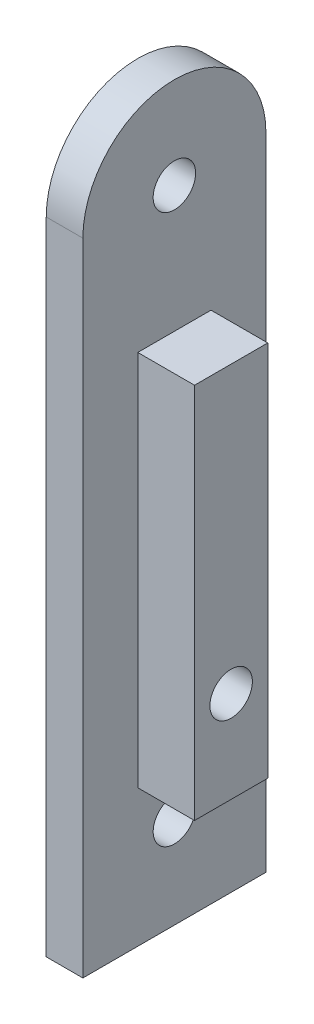
ISO-10303-21;
HEADER;
FILE_DESCRIPTION(('STEP AP214'),'2;1');
FILE_NAME('part.step','',(''),(''),'','','');
FILE_SCHEMA(('AUTOMOTIVE_DESIGN { 1 0 10303 214 1 1 1 1 }'));
ENDSEC;
DATA;
#1=APPLICATION_CONTEXT('core data for automotive mechanical design processes');
#2=APPLICATION_PROTOCOL_DEFINITION('international standard','automotive_design',2000,#1);
#3=PRODUCT_CONTEXT('',#1,'mechanical');
#4=PRODUCT('Part','Part','',(#3));
#5=PRODUCT_RELATED_PRODUCT_CATEGORY('part','',(#4));
#6=PRODUCT_DEFINITION_FORMATION('','',#4);
#7=PRODUCT_DEFINITION_CONTEXT('part definition',#1,'design');
#8=PRODUCT_DEFINITION('design','',#6,#7);
#9=PRODUCT_DEFINITION_SHAPE('','',#8);
#10=(LENGTH_UNIT() NAMED_UNIT(*) SI_UNIT(.MILLI.,.METRE.));
#11=(NAMED_UNIT(*) PLANE_ANGLE_UNIT() SI_UNIT($,.RADIAN.));
#12=(NAMED_UNIT(*) SI_UNIT($,.STERADIAN.) SOLID_ANGLE_UNIT());
#13=UNCERTAINTY_MEASURE_WITH_UNIT(LENGTH_MEASURE(1.E-05),#10,'distance_accuracy_value','');
#14=(GEOMETRIC_REPRESENTATION_CONTEXT(3) GLOBAL_UNCERTAINTY_ASSIGNED_CONTEXT((#13)) GLOBAL_UNIT_ASSIGNED_CONTEXT((#10,
#11,#12)) REPRESENTATION_CONTEXT('',''));
#15=CARTESIAN_POINT('',(0.,0.,0.));
#16=DIRECTION('',(0.,0.,1.));
#17=DIRECTION('',(1.,0.,0.));
#18=AXIS2_PLACEMENT_3D('',#15,#16,#17);
#19=CARTESIAN_POINT('',(0.,0.,0.));
#20=DIRECTION('',(1.,0.,0.));
#21=DIRECTION('',(0.,0.,-1.));
#22=AXIS2_PLACEMENT_3D('',#19,#20,#21);
#23=PLANE('',#22);
#24=CARTESIAN_POINT('',(0.,-38.1,0.));
#25=DIRECTION('',(-1.,0.,0.));
#26=DIRECTION('',(0.,0.,1.));
#27=AXIS2_PLACEMENT_3D('',#24,#25,#26);
#28=CIRCLE('',#27,1.4732);
#29=CARTESIAN_POINT('',(0.,-38.1,1.4732));
#30=VERTEX_POINT('',#29);
#31=EDGE_CURVE('E224',#30,#30,#28,.T.);
#32=ORIENTED_EDGE('',*,*,#31,.F.);
#33=EDGE_LOOP('',(#32));
#34=FACE_BOUND('',#33,.T.);
#35=CARTESIAN_POINT('',(0.,0.,0.));
#36=DIRECTION('',(1.,0.,0.));
#37=DIRECTION('',(0.,0.,-1.));
#38=AXIS2_PLACEMENT_3D('',#35,#36,#37);
#39=CIRCLE('',#38,1.4732);
#40=CARTESIAN_POINT('',(0.,0.,-1.4732));
#41=VERTEX_POINT('',#40);
#42=EDGE_CURVE('E39',#41,#41,#39,.T.);
#43=ORIENTED_EDGE('',*,*,#42,.T.);
#44=EDGE_LOOP('',(#43));
#45=FACE_BOUND('',#44,.T.);
#46=CARTESIAN_POINT('',(0.,0.,0.));
#47=DIRECTION('',(1.,0.,0.));
#48=DIRECTION('',(0.,0.,-1.));
#49=AXIS2_PLACEMENT_3D('',#46,#47,#48);
#50=CIRCLE('',#49,6.35);
#51=CARTESIAN_POINT('',(0.,0.,-6.35));
#52=VERTEX_POINT('',#51);
#53=CARTESIAN_POINT('',(0.,0.,6.35));
#54=VERTEX_POINT('',#53);
#55=EDGE_CURVE('E135',#52,#54,#50,.T.);
#56=ORIENTED_EDGE('',*,*,#55,.F.);
#57=DIRECTION('',(0.,1.,0.));
#58=VECTOR('',#57,1.);
#59=CARTESIAN_POINT('',(0.,-44.45,-6.35));
#60=LINE('',#59,#58);
#61=CARTESIAN_POINT('',(0.,-44.45,-6.35));
#62=VERTEX_POINT('',#61);
#63=EDGE_CURVE('E81',#62,#52,#60,.T.);
#64=ORIENTED_EDGE('',*,*,#63,.F.);
#65=DIRECTION('',(0.,0.,-1.));
#66=VECTOR('',#65,1.);
#67=CARTESIAN_POINT('',(0.,-44.45,-6.35));
#68=LINE('',#67,#66);
#69=CARTESIAN_POINT('',(0.,-44.45,6.34999999999999));
#70=VERTEX_POINT('',#69);
#71=EDGE_CURVE('E151',#70,#62,#68,.T.);
#72=ORIENTED_EDGE('',*,*,#71,.F.);
#73=DIRECTION('',(0.,-1.,0.));
#74=VECTOR('',#73,1.);
#75=CARTESIAN_POINT('',(0.,0.,6.35));
#76=LINE('',#75,#74);
#77=EDGE_CURVE('E138',#54,#70,#76,.T.);
#78=ORIENTED_EDGE('',*,*,#77,.F.);
#79=EDGE_LOOP('',(#56,#64,#72,#78));
#80=FACE_BOUND('',#79,.T.);
#81=CARTESIAN_POINT('',(0.,-28.575,0.));
#82=DIRECTION('',(-1.,0.,0.));
#83=DIRECTION('',(0.,0.,1.));
#84=AXIS2_PLACEMENT_3D('',#81,#82,#83);
#85=CIRCLE('',#84,1.4732);
#86=CARTESIAN_POINT('',(0.,-28.575,1.4732));
#87=VERTEX_POINT('',#86);
#88=EDGE_CURVE('E222',#87,#87,#85,.T.);
#89=ORIENTED_EDGE('',*,*,#88,.F.);
#90=EDGE_LOOP('',(#89));
#91=FACE_BOUND('',#90,.T.);
#92=ADVANCED_FACE('F35',(#34,#45,#80,#91),#23,.F.);
#93=CARTESIAN_POINT('',(2.54,0.,0.));
#94=DIRECTION('',(1.,0.,0.));
#95=DIRECTION('',(0.,0.,-1.));
#96=AXIS2_PLACEMENT_3D('',#93,#94,#95);
#97=PLANE('',#96);
#98=CARTESIAN_POINT('',(2.54,-38.1,0.));
#99=DIRECTION('',(1.,0.,0.));
#100=DIRECTION('',(0.,0.,-1.));
#101=AXIS2_PLACEMENT_3D('',#98,#99,#100);
#102=CIRCLE('',#101,1.4732);
#103=CARTESIAN_POINT('',(2.54,-38.1,-1.4732));
#104=VERTEX_POINT('',#103);
#105=EDGE_CURVE('E229',#104,#104,#102,.T.);
#106=ORIENTED_EDGE('',*,*,#105,.F.);
#107=EDGE_LOOP('',(#106));
#108=FACE_BOUND('',#107,.T.);
#109=CARTESIAN_POINT('',(2.54,0.,0.));
#110=DIRECTION('',(1.,0.,0.));
#111=DIRECTION('',(0.,0.,-1.));
#112=AXIS2_PLACEMENT_3D('',#109,#110,#111);
#113=CIRCLE('',#112,1.4732);
#114=CARTESIAN_POINT('',(2.54,0.,-1.4732));
#115=VERTEX_POINT('',#114);
#116=EDGE_CURVE('E232',#115,#115,#113,.T.);
#117=ORIENTED_EDGE('',*,*,#116,.F.);
#118=EDGE_LOOP('',(#117));
#119=FACE_BOUND('',#118,.T.);
#120=CARTESIAN_POINT('',(2.54,0.,0.));
#121=DIRECTION('',(1.,0.,0.));
#122=DIRECTION('',(0.,0.,-1.));
#123=AXIS2_PLACEMENT_3D('',#120,#121,#122);
#124=CIRCLE('',#123,6.35);
#125=CARTESIAN_POINT('',(2.54,0.,-6.35));
#126=VERTEX_POINT('',#125);
#127=CARTESIAN_POINT('',(2.54,0.,6.35));
#128=VERTEX_POINT('',#127);
#129=EDGE_CURVE('E143',#126,#128,#124,.T.);
#130=ORIENTED_EDGE('',*,*,#129,.T.);
#131=DIRECTION('',(0.,-1.,0.));
#132=VECTOR('',#131,1.);
#133=CARTESIAN_POINT('',(2.54,0.,6.35));
#134=LINE('',#133,#132);
#135=CARTESIAN_POINT('',(2.54,-44.45,6.34999999999999));
#136=VERTEX_POINT('',#135);
#137=EDGE_CURVE('E88',#128,#136,#134,.T.);
#138=ORIENTED_EDGE('',*,*,#137,.T.);
#139=DIRECTION('',(0.,0.,-1.));
#140=VECTOR('',#139,1.);
#141=CARTESIAN_POINT('',(2.54,-44.45,-6.35));
#142=LINE('',#141,#140);
#143=CARTESIAN_POINT('',(2.54,-44.45,-6.35));
#144=VERTEX_POINT('',#143);
#145=EDGE_CURVE('E146',#136,#144,#142,.T.);
#146=ORIENTED_EDGE('',*,*,#145,.T.);
#147=DIRECTION('',(0.,1.,0.));
#148=VECTOR('',#147,1.);
#149=CARTESIAN_POINT('',(2.54,-44.45,-6.35));
#150=LINE('',#149,#148);
#151=EDGE_CURVE('E60',#144,#126,#150,.T.);
#152=ORIENTED_EDGE('',*,*,#151,.T.);
#153=EDGE_LOOP('',(#130,#138,#146,#152));
#154=FACE_BOUND('',#153,.T.);
#155=DIRECTION('',(0.,1.,0.));
#156=VECTOR('',#155,1.);
#157=CARTESIAN_POINT('',(2.54,-8.77229376718203,-2.54));
#158=LINE('',#157,#156);
#159=CARTESIAN_POINT('',(2.54,-34.925,-2.54));
#160=VERTEX_POINT('',#159);
#161=CARTESIAN_POINT('',(2.54,-8.77229376718203,-2.54));
#162=VERTEX_POINT('',#161);
#163=EDGE_CURVE('E239',#160,#162,#158,.T.);
#164=ORIENTED_EDGE('',*,*,#163,.F.);
#165=DIRECTION('',(0.,0.,-1.));
#166=VECTOR('',#165,1.);
#167=CARTESIAN_POINT('',(2.54,-34.925,-2.54));
#168=LINE('',#167,#166);
#169=CARTESIAN_POINT('',(2.54,-34.925,2.54));
#170=VERTEX_POINT('',#169);
#171=EDGE_CURVE('E133',#170,#160,#168,.T.);
#172=ORIENTED_EDGE('',*,*,#171,.F.);
#173=DIRECTION('',(0.,-1.,0.));
#174=VECTOR('',#173,1.);
#175=CARTESIAN_POINT('',(2.54,-34.925,2.54));
#176=LINE('',#175,#174);
#177=CARTESIAN_POINT('',(2.54,-8.77229376718203,2.54));
#178=VERTEX_POINT('',#177);
#179=EDGE_CURVE('E129',#178,#170,#176,.T.);
#180=ORIENTED_EDGE('',*,*,#179,.F.);
#181=DIRECTION('',(0.,0.,1.));
#182=VECTOR('',#181,1.);
#183=CARTESIAN_POINT('',(2.54,-8.77229376718203,2.54));
#184=LINE('',#183,#182);
#185=EDGE_CURVE('E241',#162,#178,#184,.T.);
#186=ORIENTED_EDGE('',*,*,#185,.F.);
#187=EDGE_LOOP('',(#164,#172,#180,#186));
#188=FACE_BOUND('',#187,.T.);
#189=ADVANCED_FACE('F181',(#108,#119,#154,#188),#97,.T.);
#190=CARTESIAN_POINT('',(2.54,0.,0.));
#191=DIRECTION('',(-1.,0.,0.));
#192=DIRECTION('',(0.,0.,1.));
#193=AXIS2_PLACEMENT_3D('',#190,#191,#192);
#194=CYLINDRICAL_SURFACE('',#193,6.35);
#195=ORIENTED_EDGE('',*,*,#55,.T.);
#196=DIRECTION('',(-1.,0.,0.));
#197=VECTOR('',#196,1.);
#198=CARTESIAN_POINT('',(2.54,0.,6.35));
#199=LINE('',#198,#197);
#200=EDGE_CURVE('E11',#128,#54,#199,.T.);
#201=ORIENTED_EDGE('',*,*,#200,.F.);
#202=ORIENTED_EDGE('',*,*,#129,.F.);
#203=DIRECTION('',(-1.,0.,0.));
#204=VECTOR('',#203,1.);
#205=CARTESIAN_POINT('',(2.54,0.,-6.35));
#206=LINE('',#205,#204);
#207=EDGE_CURVE('E148',#126,#52,#206,.T.);
#208=ORIENTED_EDGE('',*,*,#207,.T.);
#209=EDGE_LOOP('',(#195,#201,#202,#208));
#210=FACE_BOUND('',#209,.T.);
#211=ADVANCED_FACE('F37',(#210),#194,.T.);
#212=CARTESIAN_POINT('',(2.54,0.,6.35));
#213=DIRECTION('',(0.,0.,-1.));
#214=DIRECTION('',(0.,1.,0.));
#215=AXIS2_PLACEMENT_3D('',#212,#213,#214);
#216=PLANE('',#215);
#217=ORIENTED_EDGE('',*,*,#77,.T.);
#218=DIRECTION('',(-1.,0.,0.));
#219=VECTOR('',#218,1.);
#220=CARTESIAN_POINT('',(2.54,-44.45,6.34999999999999));
#221=LINE('',#220,#219);
#222=EDGE_CURVE('E44',#136,#70,#221,.T.);
#223=ORIENTED_EDGE('',*,*,#222,.F.);
#224=ORIENTED_EDGE('',*,*,#137,.F.);
#225=ORIENTED_EDGE('',*,*,#200,.T.);
#226=EDGE_LOOP('',(#217,#223,#224,#225));
#227=FACE_BOUND('',#226,.T.);
#228=ADVANCED_FACE('F177',(#227),#216,.F.);
#229=CARTESIAN_POINT('',(2.54,-44.45,-6.35));
#230=DIRECTION('',(0.,1.,0.));
#231=DIRECTION('',(0.,0.,1.));
#232=AXIS2_PLACEMENT_3D('',#229,#230,#231);
#233=PLANE('',#232);
#234=ORIENTED_EDGE('',*,*,#71,.T.);
#235=DIRECTION('',(-1.,0.,0.));
#236=VECTOR('',#235,1.);
#237=CARTESIAN_POINT('',(2.54,-44.45,-6.35));
#238=LINE('',#237,#236);
#239=EDGE_CURVE('E155',#144,#62,#238,.T.);
#240=ORIENTED_EDGE('',*,*,#239,.F.);
#241=ORIENTED_EDGE('',*,*,#145,.F.);
#242=ORIENTED_EDGE('',*,*,#222,.T.);
#243=EDGE_LOOP('',(#234,#240,#241,#242));
#244=FACE_BOUND('',#243,.T.);
#245=ADVANCED_FACE('F161',(#244),#233,.F.);
#246=CARTESIAN_POINT('',(2.54,-44.45,-6.35));
#247=DIRECTION('',(0.,0.,1.));
#248=DIRECTION('',(0.,-1.,0.));
#249=AXIS2_PLACEMENT_3D('',#246,#247,#248);
#250=PLANE('',#249);
#251=ORIENTED_EDGE('',*,*,#63,.T.);
#252=ORIENTED_EDGE('',*,*,#207,.F.);
#253=ORIENTED_EDGE('',*,*,#151,.F.);
#254=ORIENTED_EDGE('',*,*,#239,.T.);
#255=EDGE_LOOP('',(#251,#252,#253,#254));
#256=FACE_BOUND('',#255,.T.);
#257=ADVANCED_FACE('F169',(#256),#250,.F.);
#258=CARTESIAN_POINT('',(6.477,-34.925,-2.54));
#259=DIRECTION('',(0.,1.,0.));
#260=DIRECTION('',(0.,0.,1.));
#261=AXIS2_PLACEMENT_3D('',#258,#259,#260);
#262=PLANE('',#261);
#263=ORIENTED_EDGE('',*,*,#171,.T.);
#264=DIRECTION('',(-1.,0.,0.));
#265=VECTOR('',#264,1.);
#266=CARTESIAN_POINT('',(6.477,-34.925,-2.54));
#267=LINE('',#266,#265);
#268=CARTESIAN_POINT('',(6.477,-34.925,-2.54));
#269=VERTEX_POINT('',#268);
#270=EDGE_CURVE('E114',#269,#160,#267,.T.);
#271=ORIENTED_EDGE('',*,*,#270,.F.);
#272=DIRECTION('',(0.,0.,-1.));
#273=VECTOR('',#272,1.);
#274=CARTESIAN_POINT('',(6.477,-34.925,-2.54));
#275=LINE('',#274,#273);
#276=CARTESIAN_POINT('',(6.477,-34.925,2.54));
#277=VERTEX_POINT('',#276);
#278=EDGE_CURVE('E121',#277,#269,#275,.T.);
#279=ORIENTED_EDGE('',*,*,#278,.F.);
#280=DIRECTION('',(-1.,0.,0.));
#281=VECTOR('',#280,1.);
#282=CARTESIAN_POINT('',(6.477,-34.925,2.54));
#283=LINE('',#282,#281);
#284=EDGE_CURVE('E237',#277,#170,#283,.T.);
#285=ORIENTED_EDGE('',*,*,#284,.T.);
#286=EDGE_LOOP('',(#263,#271,#279,#285));
#287=FACE_BOUND('',#286,.T.);
#288=ADVANCED_FACE('F131',(#287),#262,.F.);
#289=CARTESIAN_POINT('',(6.477,-8.77229376718203,-2.54));
#290=DIRECTION('',(0.,0.,1.));
#291=DIRECTION('',(0.,-1.,0.));
#292=AXIS2_PLACEMENT_3D('',#289,#290,#291);
#293=PLANE('',#292);
#294=ORIENTED_EDGE('',*,*,#163,.T.);
#295=DIRECTION('',(-1.,0.,0.));
#296=VECTOR('',#295,1.);
#297=CARTESIAN_POINT('',(6.477,-8.77229376718203,-2.54));
#298=LINE('',#297,#296);
#299=CARTESIAN_POINT('',(6.477,-8.77229376718203,-2.54));
#300=VERTEX_POINT('',#299);
#301=EDGE_CURVE('E117',#300,#162,#298,.T.);
#302=ORIENTED_EDGE('',*,*,#301,.F.);
#303=DIRECTION('',(0.,1.,0.));
#304=VECTOR('',#303,1.);
#305=CARTESIAN_POINT('',(6.477,-8.77229376718203,-2.54));
#306=LINE('',#305,#304);
#307=EDGE_CURVE('E110',#269,#300,#306,.T.);
#308=ORIENTED_EDGE('',*,*,#307,.F.);
#309=ORIENTED_EDGE('',*,*,#270,.T.);
#310=EDGE_LOOP('',(#294,#302,#308,#309));
#311=FACE_BOUND('',#310,.T.);
#312=ADVANCED_FACE('F112',(#311),#293,.F.);
#313=CARTESIAN_POINT('',(6.477,-8.77229376718203,2.54));
#314=DIRECTION('',(0.,-1.,0.));
#315=DIRECTION('',(0.,0.,-1.));
#316=AXIS2_PLACEMENT_3D('',#313,#314,#315);
#317=PLANE('',#316);
#318=ORIENTED_EDGE('',*,*,#185,.T.);
#319=DIRECTION('',(-1.,0.,0.));
#320=VECTOR('',#319,1.);
#321=CARTESIAN_POINT('',(6.477,-8.77229376718203,2.54));
#322=LINE('',#321,#320);
#323=CARTESIAN_POINT('',(6.477,-8.77229376718203,2.54));
#324=VERTEX_POINT('',#323);
#325=EDGE_CURVE('E51',#324,#178,#322,.T.);
#326=ORIENTED_EDGE('',*,*,#325,.F.);
#327=DIRECTION('',(0.,0.,1.));
#328=VECTOR('',#327,1.);
#329=CARTESIAN_POINT('',(6.477,-8.77229376718203,2.54));
#330=LINE('',#329,#328);
#331=EDGE_CURVE('E120',#300,#324,#330,.T.);
#332=ORIENTED_EDGE('',*,*,#331,.F.);
#333=ORIENTED_EDGE('',*,*,#301,.T.);
#334=EDGE_LOOP('',(#318,#326,#332,#333));
#335=FACE_BOUND('',#334,.T.);
#336=ADVANCED_FACE('F193',(#335),#317,.F.);
#337=CARTESIAN_POINT('',(6.477,-34.925,2.54));
#338=DIRECTION('',(0.,0.,-1.));
#339=DIRECTION('',(0.,1.,0.));
#340=AXIS2_PLACEMENT_3D('',#337,#338,#339);
#341=PLANE('',#340);
#342=ORIENTED_EDGE('',*,*,#179,.T.);
#343=ORIENTED_EDGE('',*,*,#284,.F.);
#344=DIRECTION('',(0.,-1.,0.));
#345=VECTOR('',#344,1.);
#346=CARTESIAN_POINT('',(6.477,-34.925,2.54));
#347=LINE('',#346,#345);
#348=EDGE_CURVE('E125',#324,#277,#347,.T.);
#349=ORIENTED_EDGE('',*,*,#348,.F.);
#350=ORIENTED_EDGE('',*,*,#325,.T.);
#351=EDGE_LOOP('',(#342,#343,#349,#350));
#352=FACE_BOUND('',#351,.T.);
#353=ADVANCED_FACE('F196',(#352),#341,.F.);
#354=CARTESIAN_POINT('',(6.477,0.,0.));
#355=DIRECTION('',(-1.,0.,0.));
#356=DIRECTION('',(0.,0.,1.));
#357=AXIS2_PLACEMENT_3D('',#354,#355,#356);
#358=PLANE('',#357);
#359=CARTESIAN_POINT('',(6.477,-28.575,0.));
#360=DIRECTION('',(-1.,0.,0.));
#361=DIRECTION('',(0.,0.,1.));
#362=AXIS2_PLACEMENT_3D('',#359,#360,#361);
#363=CIRCLE('',#362,1.4732);
#364=CARTESIAN_POINT('',(6.477,-28.575,1.4732));
#365=VERTEX_POINT('',#364);
#366=EDGE_CURVE('E219',#365,#365,#363,.T.);
#367=ORIENTED_EDGE('',*,*,#366,.T.);
#368=EDGE_LOOP('',(#367));
#369=FACE_BOUND('',#368,.T.);
#370=ORIENTED_EDGE('',*,*,#278,.T.);
#371=ORIENTED_EDGE('',*,*,#307,.T.);
#372=ORIENTED_EDGE('',*,*,#331,.T.);
#373=ORIENTED_EDGE('',*,*,#348,.T.);
#374=EDGE_LOOP('',(#370,#371,#372,#373));
#375=FACE_BOUND('',#374,.T.);
#376=ADVANCED_FACE('F124',(#369,#375),#358,.F.);
#377=CARTESIAN_POINT('',(6.477,0.,0.));
#378=DIRECTION('',(-1.,0.,0.));
#379=DIRECTION('',(0.,0.,1.));
#380=AXIS2_PLACEMENT_3D('',#377,#378,#379);
#381=CYLINDRICAL_SURFACE('',#380,1.4732);
#382=ORIENTED_EDGE('',*,*,#116,.T.);
#383=EDGE_LOOP('',(#382));
#384=FACE_BOUND('',#383,.T.);
#385=ORIENTED_EDGE('',*,*,#42,.F.);
#386=EDGE_LOOP('',(#385));
#387=FACE_BOUND('',#386,.T.);
#388=ADVANCED_FACE('F202',(#384,#387),#381,.F.);
#389=CARTESIAN_POINT('',(0.,-38.1,0.));
#390=DIRECTION('',(-1.,0.,0.));
#391=DIRECTION('',(0.,0.,1.));
#392=AXIS2_PLACEMENT_3D('',#389,#390,#391);
#393=CYLINDRICAL_SURFACE('',#392,1.4732);
#394=ORIENTED_EDGE('',*,*,#105,.T.);
#395=EDGE_LOOP('',(#394));
#396=FACE_BOUND('',#395,.T.);
#397=ORIENTED_EDGE('',*,*,#31,.T.);
#398=EDGE_LOOP('',(#397));
#399=FACE_BOUND('',#398,.T.);
#400=ADVANCED_FACE('F206',(#396,#399),#393,.F.);
#401=CARTESIAN_POINT('',(0.,-28.575,0.));
#402=DIRECTION('',(-1.,0.,0.));
#403=DIRECTION('',(0.,0.,1.));
#404=AXIS2_PLACEMENT_3D('',#401,#402,#403);
#405=CYLINDRICAL_SURFACE('',#404,1.4732);
#406=ORIENTED_EDGE('',*,*,#366,.F.);
#407=EDGE_LOOP('',(#406));
#408=FACE_BOUND('',#407,.T.);
#409=ORIENTED_EDGE('',*,*,#88,.T.);
#410=EDGE_LOOP('',(#409));
#411=FACE_BOUND('',#410,.T.);
#412=ADVANCED_FACE('F210',(#408,#411),#405,.F.);
#413=CLOSED_SHELL('',(#92,#189,#211,#228,#245,#257,#288,#312,#336,#353,#376,#388,#400,#412));
#414=MANIFOLD_SOLID_BREP('B2',#413);
#415=ADVANCED_BREP_SHAPE_REPRESENTATION('',(#18,#414),#14);
#416=SHAPE_DEFINITION_REPRESENTATION(#9,#415);
ENDSEC;
END-ISO-10303-21;
